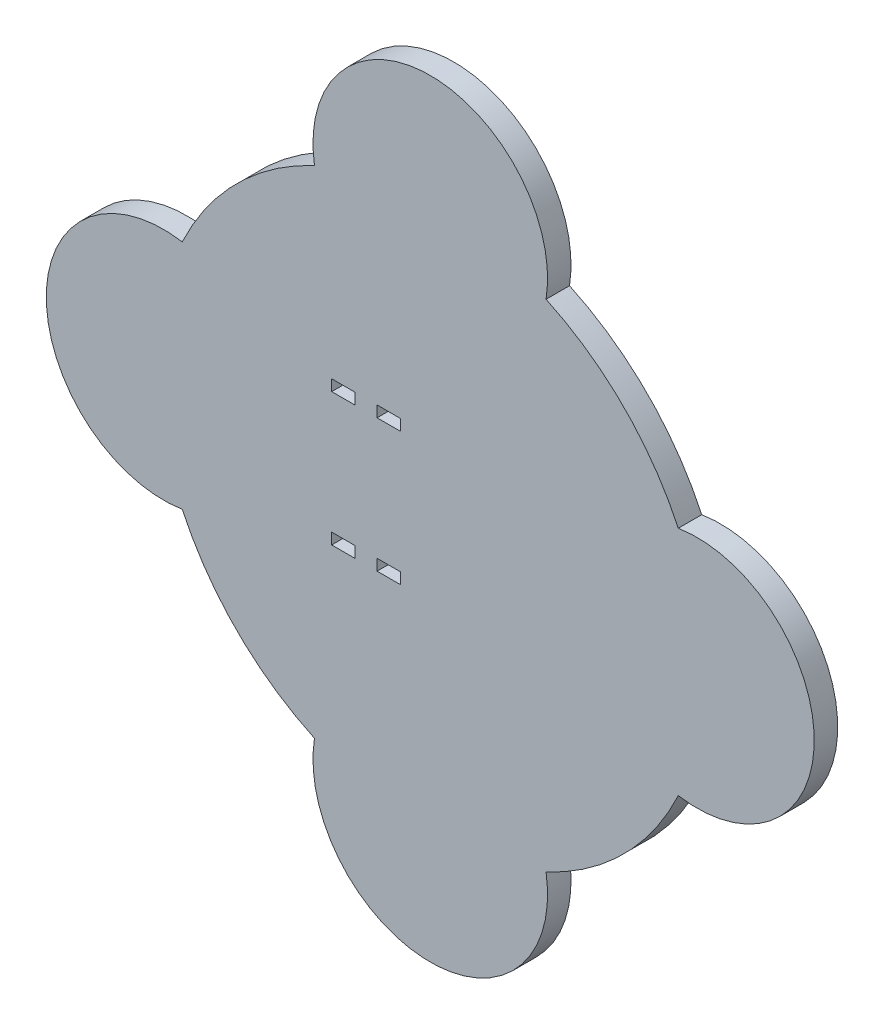
ISO-10303-21;
HEADER;
FILE_DESCRIPTION(('STEP AP214'),'2;1');
FILE_NAME('part.step','',(''),(''),'','','');
FILE_SCHEMA(('AUTOMOTIVE_DESIGN { 1 0 10303 214 1 1 1 1 }'));
ENDSEC;
DATA;
#1=APPLICATION_CONTEXT('core data for automotive mechanical design processes');
#2=APPLICATION_PROTOCOL_DEFINITION('international standard','automotive_design',2000,#1);
#3=PRODUCT_CONTEXT('',#1,'mechanical');
#4=PRODUCT('Part','Part','',(#3));
#5=PRODUCT_RELATED_PRODUCT_CATEGORY('part','',(#4));
#6=PRODUCT_DEFINITION_FORMATION('','',#4);
#7=PRODUCT_DEFINITION_CONTEXT('part definition',#1,'design');
#8=PRODUCT_DEFINITION('design','',#6,#7);
#9=PRODUCT_DEFINITION_SHAPE('','',#8);
#10=(LENGTH_UNIT() NAMED_UNIT(*) SI_UNIT(.MILLI.,.METRE.));
#11=(NAMED_UNIT(*) PLANE_ANGLE_UNIT() SI_UNIT($,.RADIAN.));
#12=(NAMED_UNIT(*) SI_UNIT($,.STERADIAN.) SOLID_ANGLE_UNIT());
#13=UNCERTAINTY_MEASURE_WITH_UNIT(LENGTH_MEASURE(1.E-05),#10,'distance_accuracy_value','');
#14=(GEOMETRIC_REPRESENTATION_CONTEXT(3) GLOBAL_UNCERTAINTY_ASSIGNED_CONTEXT((#13)) GLOBAL_UNIT_ASSIGNED_CONTEXT((#10,
#11,#12)) REPRESENTATION_CONTEXT('',''));
#15=CARTESIAN_POINT('',(0.,0.,0.));
#16=DIRECTION('',(0.,0.,1.));
#17=DIRECTION('',(1.,0.,0.));
#18=AXIS2_PLACEMENT_3D('',#15,#16,#17);
#19=CARTESIAN_POINT('',(0.,0.,3.));
#20=DIRECTION('',(0.,0.,-1.));
#21=DIRECTION('',(-1.,0.,0.));
#22=AXIS2_PLACEMENT_3D('',#19,#20,#21);
#23=CYLINDRICAL_SURFACE('',#22,35.);
#24=CARTESIAN_POINT('',(0.,0.,0.));
#25=DIRECTION('',(0.,0.,1.));
#26=DIRECTION('',(1.,0.,0.));
#27=AXIS2_PLACEMENT_3D('',#24,#25,#26);
#28=CIRCLE('',#27,35.);
#29=CARTESIAN_POINT('',(-14.8082520023187,31.7130205536436,0.));
#30=VERTEX_POINT('',#29);
#31=CARTESIAN_POINT('',(-31.7130205536436,14.8082520023187,0.));
#32=VERTEX_POINT('',#31);
#33=EDGE_CURVE('E322',#30,#32,#28,.T.);
#34=ORIENTED_EDGE('',*,*,#33,.T.);
#35=DIRECTION('',(0.,0.,-1.));
#36=VECTOR('',#35,1.);
#37=CARTESIAN_POINT('',(-31.7130205536436,14.8082520023187,3.));
#38=LINE('',#37,#36);
#39=CARTESIAN_POINT('',(-31.7130205536436,14.8082520023187,3.));
#40=VERTEX_POINT('',#39);
#41=EDGE_CURVE('E11',#40,#32,#38,.T.);
#42=ORIENTED_EDGE('',*,*,#41,.F.);
#43=CARTESIAN_POINT('',(0.,0.,3.));
#44=DIRECTION('',(0.,0.,1.));
#45=DIRECTION('',(1.,0.,0.));
#46=AXIS2_PLACEMENT_3D('',#43,#44,#45);
#47=CIRCLE('',#46,35.);
#48=CARTESIAN_POINT('',(-14.8082520023187,31.7130205536436,3.));
#49=VERTEX_POINT('',#48);
#50=EDGE_CURVE('E323',#49,#40,#47,.T.);
#51=ORIENTED_EDGE('',*,*,#50,.F.);
#52=DIRECTION('',(0.,0.,-1.));
#53=VECTOR('',#52,1.);
#54=CARTESIAN_POINT('',(-14.8082520023187,31.7130205536436,3.));
#55=LINE('',#54,#53);
#56=EDGE_CURVE('E341',#49,#30,#55,.T.);
#57=ORIENTED_EDGE('',*,*,#56,.T.);
#58=EDGE_LOOP('',(#34,#42,#51,#57));
#59=FACE_BOUND('',#58,.T.);
#60=ADVANCED_FACE('F32',(#59),#23,.T.);
#61=CARTESIAN_POINT('',(-34.1037678501647,0.,3.));
#62=DIRECTION('',(0.,0.,-1.));
#63=DIRECTION('',(-1.,0.,0.));
#64=AXIS2_PLACEMENT_3D('',#61,#62,#63);
#65=CYLINDRICAL_SURFACE('',#64,15.);
#66=CARTESIAN_POINT('',(-34.1037678501647,0.,0.));
#67=DIRECTION('',(0.,0.,1.));
#68=DIRECTION('',(-1.,0.,0.));
#69=AXIS2_PLACEMENT_3D('',#66,#67,#68);
#70=CIRCLE('',#69,15.);
#71=CARTESIAN_POINT('',(-31.7130205536436,-14.8082520023187,0.));
#72=VERTEX_POINT('',#71);
#73=EDGE_CURVE('E344',#32,#72,#70,.T.);
#74=ORIENTED_EDGE('',*,*,#73,.T.);
#75=DIRECTION('',(0.,0.,-1.));
#76=VECTOR('',#75,1.);
#77=CARTESIAN_POINT('',(-31.7130205536436,-14.8082520023187,3.));
#78=LINE('',#77,#76);
#79=CARTESIAN_POINT('',(-31.7130205536436,-14.8082520023187,3.));
#80=VERTEX_POINT('',#79);
#81=EDGE_CURVE('E39',#80,#72,#78,.T.);
#82=ORIENTED_EDGE('',*,*,#81,.F.);
#83=CARTESIAN_POINT('',(-34.1037678501647,0.,3.));
#84=DIRECTION('',(0.,0.,1.));
#85=DIRECTION('',(-1.,0.,0.));
#86=AXIS2_PLACEMENT_3D('',#83,#84,#85);
#87=CIRCLE('',#86,15.);
#88=EDGE_CURVE('E326',#40,#80,#87,.T.);
#89=ORIENTED_EDGE('',*,*,#88,.F.);
#90=ORIENTED_EDGE('',*,*,#41,.T.);
#91=EDGE_LOOP('',(#74,#82,#89,#90));
#92=FACE_BOUND('',#91,.T.);
#93=ADVANCED_FACE('F400',(#92),#65,.T.);
#94=CARTESIAN_POINT('',(0.,0.,3.));
#95=DIRECTION('',(0.,0.,-1.));
#96=DIRECTION('',(-1.,0.,0.));
#97=AXIS2_PLACEMENT_3D('',#94,#95,#96);
#98=CYLINDRICAL_SURFACE('',#97,35.);
#99=CARTESIAN_POINT('',(0.,0.,0.));
#100=DIRECTION('',(0.,0.,1.));
#101=DIRECTION('',(1.,0.,0.));
#102=AXIS2_PLACEMENT_3D('',#99,#100,#101);
#103=CIRCLE('',#102,35.);
#104=CARTESIAN_POINT('',(-14.8082520023187,-31.7130205536436,0.));
#105=VERTEX_POINT('',#104);
#106=EDGE_CURVE('E346',#72,#105,#103,.T.);
#107=ORIENTED_EDGE('',*,*,#106,.T.);
#108=DIRECTION('',(0.,0.,-1.));
#109=VECTOR('',#108,1.);
#110=CARTESIAN_POINT('',(-14.8082520023187,-31.7130205536436,3.));
#111=LINE('',#110,#109);
#112=CARTESIAN_POINT('',(-14.8082520023187,-31.7130205536436,3.));
#113=VERTEX_POINT('',#112);
#114=EDGE_CURVE('E371',#113,#105,#111,.T.);
#115=ORIENTED_EDGE('',*,*,#114,.F.);
#116=CARTESIAN_POINT('',(0.,0.,3.));
#117=DIRECTION('',(0.,0.,1.));
#118=DIRECTION('',(1.,0.,0.));
#119=AXIS2_PLACEMENT_3D('',#116,#117,#118);
#120=CIRCLE('',#119,35.);
#121=EDGE_CURVE('E329',#80,#113,#120,.T.);
#122=ORIENTED_EDGE('',*,*,#121,.F.);
#123=ORIENTED_EDGE('',*,*,#81,.T.);
#124=EDGE_LOOP('',(#107,#115,#122,#123));
#125=FACE_BOUND('',#124,.T.);
#126=ADVANCED_FACE('F378',(#125),#98,.T.);
#127=CARTESIAN_POINT('',(0.,-34.1037678501647,3.));
#128=DIRECTION('',(0.,0.,-1.));
#129=DIRECTION('',(-1.,0.,0.));
#130=AXIS2_PLACEMENT_3D('',#127,#128,#129);
#131=CYLINDRICAL_SURFACE('',#130,15.);
#132=CARTESIAN_POINT('',(0.,-34.1037678501647,0.));
#133=DIRECTION('',(0.,0.,1.));
#134=DIRECTION('',(-1.,0.,0.));
#135=AXIS2_PLACEMENT_3D('',#132,#133,#134);
#136=CIRCLE('',#135,15.);
#137=CARTESIAN_POINT('',(14.8082520023187,-31.7130205536436,0.));
#138=VERTEX_POINT('',#137);
#139=EDGE_CURVE('E348',#105,#138,#136,.T.);
#140=ORIENTED_EDGE('',*,*,#139,.T.);
#141=DIRECTION('',(0.,0.,-1.));
#142=VECTOR('',#141,1.);
#143=CARTESIAN_POINT('',(14.8082520023187,-31.7130205536436,3.));
#144=LINE('',#143,#142);
#145=CARTESIAN_POINT('',(14.8082520023187,-31.7130205536436,3.));
#146=VERTEX_POINT('',#145);
#147=EDGE_CURVE('E368',#146,#138,#144,.T.);
#148=ORIENTED_EDGE('',*,*,#147,.F.);
#149=CARTESIAN_POINT('',(0.,-34.1037678501647,3.));
#150=DIRECTION('',(0.,0.,1.));
#151=DIRECTION('',(-1.,0.,0.));
#152=AXIS2_PLACEMENT_3D('',#149,#150,#151);
#153=CIRCLE('',#152,15.);
#154=EDGE_CURVE('E331',#113,#146,#153,.T.);
#155=ORIENTED_EDGE('',*,*,#154,.F.);
#156=ORIENTED_EDGE('',*,*,#114,.T.);
#157=EDGE_LOOP('',(#140,#148,#155,#156));
#158=FACE_BOUND('',#157,.T.);
#159=ADVANCED_FACE('F388',(#158),#131,.T.);
#160=CARTESIAN_POINT('',(0.,0.,3.));
#161=DIRECTION('',(0.,0.,-1.));
#162=DIRECTION('',(-1.,0.,0.));
#163=AXIS2_PLACEMENT_3D('',#160,#161,#162);
#164=CYLINDRICAL_SURFACE('',#163,35.);
#165=CARTESIAN_POINT('',(0.,0.,0.));
#166=DIRECTION('',(0.,0.,1.));
#167=DIRECTION('',(1.,0.,0.));
#168=AXIS2_PLACEMENT_3D('',#165,#166,#167);
#169=CIRCLE('',#168,35.);
#170=CARTESIAN_POINT('',(31.7130205536436,-14.8082520023187,0.));
#171=VERTEX_POINT('',#170);
#172=EDGE_CURVE('E350',#138,#171,#169,.T.);
#173=ORIENTED_EDGE('',*,*,#172,.T.);
#174=DIRECTION('',(0.,0.,-1.));
#175=VECTOR('',#174,1.);
#176=CARTESIAN_POINT('',(31.7130205536436,-14.8082520023187,3.));
#177=LINE('',#176,#175);
#178=CARTESIAN_POINT('',(31.7130205536436,-14.8082520023187,3.));
#179=VERTEX_POINT('',#178);
#180=EDGE_CURVE('E365',#179,#171,#177,.T.);
#181=ORIENTED_EDGE('',*,*,#180,.F.);
#182=CARTESIAN_POINT('',(0.,0.,3.));
#183=DIRECTION('',(0.,0.,1.));
#184=DIRECTION('',(1.,0.,0.));
#185=AXIS2_PLACEMENT_3D('',#182,#183,#184);
#186=CIRCLE('',#185,35.);
#187=EDGE_CURVE('E333',#146,#179,#186,.T.);
#188=ORIENTED_EDGE('',*,*,#187,.F.);
#189=ORIENTED_EDGE('',*,*,#147,.T.);
#190=EDGE_LOOP('',(#173,#181,#188,#189));
#191=FACE_BOUND('',#190,.T.);
#192=ADVANCED_FACE('F392',(#191),#164,.T.);
#193=CARTESIAN_POINT('',(34.1037678501647,0.,3.));
#194=DIRECTION('',(0.,0.,-1.));
#195=DIRECTION('',(-1.,0.,0.));
#196=AXIS2_PLACEMENT_3D('',#193,#194,#195);
#197=CYLINDRICAL_SURFACE('',#196,15.);
#198=CARTESIAN_POINT('',(34.1037678501647,0.,0.));
#199=DIRECTION('',(0.,0.,1.));
#200=DIRECTION('',(-1.,0.,0.));
#201=AXIS2_PLACEMENT_3D('',#198,#199,#200);
#202=CIRCLE('',#201,15.);
#203=CARTESIAN_POINT('',(31.7130205536436,14.8082520023187,0.));
#204=VERTEX_POINT('',#203);
#205=EDGE_CURVE('E352',#171,#204,#202,.T.);
#206=ORIENTED_EDGE('',*,*,#205,.T.);
#207=DIRECTION('',(0.,0.,-1.));
#208=VECTOR('',#207,1.);
#209=CARTESIAN_POINT('',(31.7130205536436,14.8082520023187,3.));
#210=LINE('',#209,#208);
#211=CARTESIAN_POINT('',(31.7130205536436,14.8082520023187,3.));
#212=VERTEX_POINT('',#211);
#213=EDGE_CURVE('E362',#212,#204,#210,.T.);
#214=ORIENTED_EDGE('',*,*,#213,.F.);
#215=CARTESIAN_POINT('',(34.1037678501647,0.,3.));
#216=DIRECTION('',(0.,0.,1.));
#217=DIRECTION('',(-1.,0.,0.));
#218=AXIS2_PLACEMENT_3D('',#215,#216,#217);
#219=CIRCLE('',#218,15.);
#220=EDGE_CURVE('E335',#179,#212,#219,.T.);
#221=ORIENTED_EDGE('',*,*,#220,.F.);
#222=ORIENTED_EDGE('',*,*,#180,.T.);
#223=EDGE_LOOP('',(#206,#214,#221,#222));
#224=FACE_BOUND('',#223,.T.);
#225=ADVANCED_FACE('F413',(#224),#197,.T.);
#226=CARTESIAN_POINT('',(0.,0.,3.));
#227=DIRECTION('',(0.,0.,-1.));
#228=DIRECTION('',(-1.,0.,0.));
#229=AXIS2_PLACEMENT_3D('',#226,#227,#228);
#230=CYLINDRICAL_SURFACE('',#229,35.);
#231=CARTESIAN_POINT('',(0.,0.,0.));
#232=DIRECTION('',(0.,0.,1.));
#233=DIRECTION('',(1.,0.,0.));
#234=AXIS2_PLACEMENT_3D('',#231,#232,#233);
#235=CIRCLE('',#234,35.);
#236=CARTESIAN_POINT('',(14.8082520023187,31.7130205536436,0.));
#237=VERTEX_POINT('',#236);
#238=EDGE_CURVE('E354',#204,#237,#235,.T.);
#239=ORIENTED_EDGE('',*,*,#238,.T.);
#240=DIRECTION('',(0.,0.,-1.));
#241=VECTOR('',#240,1.);
#242=CARTESIAN_POINT('',(14.8082520023187,31.7130205536436,3.));
#243=LINE('',#242,#241);
#244=CARTESIAN_POINT('',(14.8082520023187,31.7130205536436,3.));
#245=VERTEX_POINT('',#244);
#246=EDGE_CURVE('E359',#245,#237,#243,.T.);
#247=ORIENTED_EDGE('',*,*,#246,.F.);
#248=CARTESIAN_POINT('',(0.,0.,3.));
#249=DIRECTION('',(0.,0.,1.));
#250=DIRECTION('',(1.,0.,0.));
#251=AXIS2_PLACEMENT_3D('',#248,#249,#250);
#252=CIRCLE('',#251,35.);
#253=EDGE_CURVE('E337',#212,#245,#252,.T.);
#254=ORIENTED_EDGE('',*,*,#253,.F.);
#255=ORIENTED_EDGE('',*,*,#213,.T.);
#256=EDGE_LOOP('',(#239,#247,#254,#255));
#257=FACE_BOUND('',#256,.T.);
#258=ADVANCED_FACE('F411',(#257),#230,.T.);
#259=CARTESIAN_POINT('',(0.,34.1037678501647,3.));
#260=DIRECTION('',(0.,0.,-1.));
#261=DIRECTION('',(-1.,0.,0.));
#262=AXIS2_PLACEMENT_3D('',#259,#260,#261);
#263=CYLINDRICAL_SURFACE('',#262,15.);
#264=CARTESIAN_POINT('',(0.,34.1037678501647,0.));
#265=DIRECTION('',(0.,0.,1.));
#266=DIRECTION('',(-1.,0.,0.));
#267=AXIS2_PLACEMENT_3D('',#264,#265,#266);
#268=CIRCLE('',#267,15.);
#269=EDGE_CURVE('E327',#237,#30,#268,.T.);
#270=ORIENTED_EDGE('',*,*,#269,.T.);
#271=ORIENTED_EDGE('',*,*,#56,.F.);
#272=CARTESIAN_POINT('',(0.,34.1037678501647,3.));
#273=DIRECTION('',(0.,0.,1.));
#274=DIRECTION('',(-1.,0.,0.));
#275=AXIS2_PLACEMENT_3D('',#272,#273,#274);
#276=CIRCLE('',#275,15.);
#277=EDGE_CURVE('E339',#245,#49,#276,.T.);
#278=ORIENTED_EDGE('',*,*,#277,.F.);
#279=ORIENTED_EDGE('',*,*,#246,.T.);
#280=EDGE_LOOP('',(#270,#271,#278,#279));
#281=FACE_BOUND('',#280,.T.);
#282=ADVANCED_FACE('F406',(#281),#263,.T.);
#283=CARTESIAN_POINT('',(-17.0518839250824,0.,3.));
#284=DIRECTION('',(0.,0.,1.));
#285=DIRECTION('',(1.,0.,0.));
#286=AXIS2_PLACEMENT_3D('',#283,#284,#285);
#287=PLANE('',#286);
#288=DIRECTION('',(-1.,0.,0.));
#289=VECTOR('',#288,1.);
#290=CARTESIAN_POINT('',(-6.80376785016473,9.20196326465761,3.));
#291=LINE('',#290,#289);
#292=CARTESIAN_POINT('',(-3.80376785016473,9.20196326465761,3.));
#293=VERTEX_POINT('',#292);
#294=CARTESIAN_POINT('',(-6.80376785016473,9.20196326465761,3.));
#295=VERTEX_POINT('',#294);
#296=EDGE_CURVE('E46',#293,#295,#291,.T.);
#297=ORIENTED_EDGE('',*,*,#296,.F.);
#298=DIRECTION('',(0.,1.,0.));
#299=VECTOR('',#298,1.);
#300=CARTESIAN_POINT('',(-3.80376785016473,9.20196326465761,3.));
#301=LINE('',#300,#299);
#302=CARTESIAN_POINT('',(-3.80376785016473,7.77947969500303,3.));
#303=VERTEX_POINT('',#302);
#304=EDGE_CURVE('E200',#303,#293,#301,.T.);
#305=ORIENTED_EDGE('',*,*,#304,.F.);
#306=DIRECTION('',(1.,0.,0.));
#307=VECTOR('',#306,1.);
#308=CARTESIAN_POINT('',(-6.80376785016473,7.77947969500303,3.));
#309=LINE('',#308,#307);
#310=CARTESIAN_POINT('',(-6.80376785016473,7.77947969500303,3.));
#311=VERTEX_POINT('',#310);
#312=EDGE_CURVE('E223',#311,#303,#309,.T.);
#313=ORIENTED_EDGE('',*,*,#312,.F.);
#314=DIRECTION('',(0.,-1.,0.));
#315=VECTOR('',#314,1.);
#316=CARTESIAN_POINT('',(-6.80376785016473,9.20196326465761,3.));
#317=LINE('',#316,#315);
#318=EDGE_CURVE('E216',#295,#311,#317,.T.);
#319=ORIENTED_EDGE('',*,*,#318,.F.);
#320=EDGE_LOOP('',(#297,#305,#313,#319));
#321=FACE_BOUND('',#320,.T.);
#322=DIRECTION('',(-1.,0.,0.));
#323=VECTOR('',#322,1.);
#324=CARTESIAN_POINT('',(-9.60376785016472,9.20196326465761,3.));
#325=LINE('',#324,#323);
#326=CARTESIAN_POINT('',(-9.60376785016472,9.20196326465761,3.));
#327=VERTEX_POINT('',#326);
#328=CARTESIAN_POINT('',(-12.6037678501647,9.20196326465761,3.));
#329=VERTEX_POINT('',#328);
#330=EDGE_CURVE('E54',#327,#329,#325,.T.);
#331=ORIENTED_EDGE('',*,*,#330,.F.);
#332=DIRECTION('',(0.,1.,0.));
#333=VECTOR('',#332,1.);
#334=CARTESIAN_POINT('',(-9.60376785016472,9.20196326465761,3.));
#335=LINE('',#334,#333);
#336=CARTESIAN_POINT('',(-9.60376785016472,7.77947969500303,3.));
#337=VERTEX_POINT('',#336);
#338=EDGE_CURVE('E248',#337,#327,#335,.T.);
#339=ORIENTED_EDGE('',*,*,#338,.F.);
#340=DIRECTION('',(1.,0.,0.));
#341=VECTOR('',#340,1.);
#342=CARTESIAN_POINT('',(-9.60376785016472,7.77947969500303,3.));
#343=LINE('',#342,#341);
#344=CARTESIAN_POINT('',(-12.6037678501647,7.77947969500303,3.));
#345=VERTEX_POINT('',#344);
#346=EDGE_CURVE('E245',#345,#337,#343,.T.);
#347=ORIENTED_EDGE('',*,*,#346,.F.);
#348=DIRECTION('',(0.,-1.,0.));
#349=VECTOR('',#348,1.);
#350=CARTESIAN_POINT('',(-12.6037678501647,9.20196326465761,3.));
#351=LINE('',#350,#349);
#352=EDGE_CURVE('E242',#329,#345,#351,.T.);
#353=ORIENTED_EDGE('',*,*,#352,.F.);
#354=EDGE_LOOP('',(#331,#339,#347,#353));
#355=FACE_BOUND('',#354,.T.);
#356=DIRECTION('',(1.,0.,0.));
#357=VECTOR('',#356,1.);
#358=CARTESIAN_POINT('',(-9.60376785016472,-9.20196326465761,3.));
#359=LINE('',#358,#357);
#360=CARTESIAN_POINT('',(-12.6037678501647,-9.20196326465761,3.));
#361=VERTEX_POINT('',#360);
#362=CARTESIAN_POINT('',(-9.60376785016472,-9.20196326465761,3.));
#363=VERTEX_POINT('',#362);
#364=EDGE_CURVE('E270',#361,#363,#359,.T.);
#365=ORIENTED_EDGE('',*,*,#364,.F.);
#366=DIRECTION('',(0.,-1.,0.));
#367=VECTOR('',#366,1.);
#368=CARTESIAN_POINT('',(-12.6037678501647,-9.20196326465761,3.));
#369=LINE('',#368,#367);
#370=CARTESIAN_POINT('',(-12.6037678501647,-7.77947969500303,3.));
#371=VERTEX_POINT('',#370);
#372=EDGE_CURVE('E278',#371,#361,#369,.T.);
#373=ORIENTED_EDGE('',*,*,#372,.F.);
#374=DIRECTION('',(-1.,0.,0.));
#375=VECTOR('',#374,1.);
#376=CARTESIAN_POINT('',(-9.60376785016472,-7.77947969500303,3.));
#377=LINE('',#376,#375);
#378=CARTESIAN_POINT('',(-9.60376785016472,-7.77947969500303,3.));
#379=VERTEX_POINT('',#378);
#380=EDGE_CURVE('E275',#379,#371,#377,.T.);
#381=ORIENTED_EDGE('',*,*,#380,.F.);
#382=DIRECTION('',(0.,1.,0.));
#383=VECTOR('',#382,1.);
#384=CARTESIAN_POINT('',(-9.60376785016472,-9.20196326465761,3.));
#385=LINE('',#384,#383);
#386=EDGE_CURVE('E272',#363,#379,#385,.T.);
#387=ORIENTED_EDGE('',*,*,#386,.F.);
#388=EDGE_LOOP('',(#365,#373,#381,#387));
#389=FACE_BOUND('',#388,.T.);
#390=DIRECTION('',(0.,1.,0.));
#391=VECTOR('',#390,1.);
#392=CARTESIAN_POINT('',(-3.80376785016473,-9.20196326465761,3.));
#393=LINE('',#392,#391);
#394=CARTESIAN_POINT('',(-3.80376785016473,-9.20196326465761,3.));
#395=VERTEX_POINT('',#394);
#396=CARTESIAN_POINT('',(-3.80376785016473,-7.77947969500303,3.));
#397=VERTEX_POINT('',#396);
#398=EDGE_CURVE('E299',#395,#397,#393,.T.);
#399=ORIENTED_EDGE('',*,*,#398,.F.);
#400=DIRECTION('',(1.,0.,0.));
#401=VECTOR('',#400,1.);
#402=CARTESIAN_POINT('',(-6.80376785016473,-9.20196326465761,3.));
#403=LINE('',#402,#401);
#404=CARTESIAN_POINT('',(-6.80376785016473,-9.20196326465761,3.));
#405=VERTEX_POINT('',#404);
#406=EDGE_CURVE('E307',#405,#395,#403,.T.);
#407=ORIENTED_EDGE('',*,*,#406,.F.);
#408=DIRECTION('',(0.,-1.,0.));
#409=VECTOR('',#408,1.);
#410=CARTESIAN_POINT('',(-6.80376785016473,-9.20196326465761,3.));
#411=LINE('',#410,#409);
#412=CARTESIAN_POINT('',(-6.80376785016473,-7.77947969500303,3.));
#413=VERTEX_POINT('',#412);
#414=EDGE_CURVE('E304',#413,#405,#411,.T.);
#415=ORIENTED_EDGE('',*,*,#414,.F.);
#416=DIRECTION('',(-1.,0.,0.));
#417=VECTOR('',#416,1.);
#418=CARTESIAN_POINT('',(-6.80376785016473,-7.77947969500303,3.));
#419=LINE('',#418,#417);
#420=EDGE_CURVE('E301',#397,#413,#419,.T.);
#421=ORIENTED_EDGE('',*,*,#420,.F.);
#422=EDGE_LOOP('',(#399,#407,#415,#421));
#423=FACE_BOUND('',#422,.T.);
#424=ORIENTED_EDGE('',*,*,#50,.T.);
#425=ORIENTED_EDGE('',*,*,#88,.T.);
#426=ORIENTED_EDGE('',*,*,#121,.T.);
#427=ORIENTED_EDGE('',*,*,#154,.T.);
#428=ORIENTED_EDGE('',*,*,#187,.T.);
#429=ORIENTED_EDGE('',*,*,#220,.T.);
#430=ORIENTED_EDGE('',*,*,#253,.T.);
#431=ORIENTED_EDGE('',*,*,#277,.T.);
#432=EDGE_LOOP('',(#424,#425,#426,#427,#428,#429,#430,#431));
#433=FACE_BOUND('',#432,.T.);
#434=ADVANCED_FACE('F396',(#321,#355,#389,#423,#433),#287,.T.);
#435=CARTESIAN_POINT('',(-17.0518839250824,0.,0.));
#436=DIRECTION('',(0.,0.,1.));
#437=DIRECTION('',(1.,0.,0.));
#438=AXIS2_PLACEMENT_3D('',#435,#436,#437);
#439=PLANE('',#438);
#440=DIRECTION('',(0.,-1.,0.));
#441=VECTOR('',#440,1.);
#442=CARTESIAN_POINT('',(-3.80376785016473,9.20196326465761,0.));
#443=LINE('',#442,#441);
#444=CARTESIAN_POINT('',(-3.80376785016473,9.20196326465761,0.));
#445=VERTEX_POINT('',#444);
#446=CARTESIAN_POINT('',(-3.80376785016473,7.77947969500303,0.));
#447=VERTEX_POINT('',#446);
#448=EDGE_CURVE('E214',#445,#447,#443,.T.);
#449=ORIENTED_EDGE('',*,*,#448,.F.);
#450=DIRECTION('',(1.,0.,0.));
#451=VECTOR('',#450,1.);
#452=CARTESIAN_POINT('',(-6.80376785016473,9.20196326465761,0.));
#453=LINE('',#452,#451);
#454=CARTESIAN_POINT('',(-6.80376785016473,9.20196326465761,0.));
#455=VERTEX_POINT('',#454);
#456=EDGE_CURVE('E194',#455,#445,#453,.T.);
#457=ORIENTED_EDGE('',*,*,#456,.F.);
#458=DIRECTION('',(0.,1.,0.));
#459=VECTOR('',#458,1.);
#460=CARTESIAN_POINT('',(-6.80376785016473,9.20196326465761,0.));
#461=LINE('',#460,#459);
#462=CARTESIAN_POINT('',(-6.80376785016473,7.77947969500303,0.));
#463=VERTEX_POINT('',#462);
#464=EDGE_CURVE('E204',#463,#455,#461,.T.);
#465=ORIENTED_EDGE('',*,*,#464,.F.);
#466=DIRECTION('',(-1.,0.,0.));
#467=VECTOR('',#466,1.);
#468=CARTESIAN_POINT('',(-6.80376785016473,7.77947969500303,0.));
#469=LINE('',#468,#467);
#470=EDGE_CURVE('E218',#447,#463,#469,.T.);
#471=ORIENTED_EDGE('',*,*,#470,.F.);
#472=EDGE_LOOP('',(#449,#457,#465,#471));
#473=FACE_BOUND('',#472,.T.);
#474=DIRECTION('',(0.,-1.,0.));
#475=VECTOR('',#474,1.);
#476=CARTESIAN_POINT('',(-9.60376785016472,9.20196326465761,0.));
#477=LINE('',#476,#475);
#478=CARTESIAN_POINT('',(-9.60376785016472,9.20196326465761,0.));
#479=VERTEX_POINT('',#478);
#480=CARTESIAN_POINT('',(-9.60376785016472,7.77947969500303,0.));
#481=VERTEX_POINT('',#480);
#482=EDGE_CURVE('E234',#479,#481,#477,.T.);
#483=ORIENTED_EDGE('',*,*,#482,.F.);
#484=DIRECTION('',(1.,0.,0.));
#485=VECTOR('',#484,1.);
#486=CARTESIAN_POINT('',(-9.60376785016472,9.20196326465761,0.));
#487=LINE('',#486,#485);
#488=CARTESIAN_POINT('',(-12.6037678501647,9.20196326465761,0.));
#489=VERTEX_POINT('',#488);
#490=EDGE_CURVE('E238',#489,#479,#487,.T.);
#491=ORIENTED_EDGE('',*,*,#490,.F.);
#492=DIRECTION('',(0.,1.,0.));
#493=VECTOR('',#492,1.);
#494=CARTESIAN_POINT('',(-12.6037678501647,9.20196326465761,0.));
#495=LINE('',#494,#493);
#496=CARTESIAN_POINT('',(-12.6037678501647,7.77947969500303,0.));
#497=VERTEX_POINT('',#496);
#498=EDGE_CURVE('E254',#497,#489,#495,.T.);
#499=ORIENTED_EDGE('',*,*,#498,.F.);
#500=DIRECTION('',(-1.,0.,0.));
#501=VECTOR('',#500,1.);
#502=CARTESIAN_POINT('',(-9.60376785016472,7.77947969500303,0.));
#503=LINE('',#502,#501);
#504=EDGE_CURVE('E232',#481,#497,#503,.T.);
#505=ORIENTED_EDGE('',*,*,#504,.F.);
#506=EDGE_LOOP('',(#483,#491,#499,#505));
#507=FACE_BOUND('',#506,.T.);
#508=DIRECTION('',(0.,1.,0.));
#509=VECTOR('',#508,1.);
#510=CARTESIAN_POINT('',(-12.6037678501647,-9.20196326465761,0.));
#511=LINE('',#510,#509);
#512=CARTESIAN_POINT('',(-12.6037678501647,-9.20196326465761,0.));
#513=VERTEX_POINT('',#512);
#514=CARTESIAN_POINT('',(-12.6037678501647,-7.77947969500303,0.));
#515=VERTEX_POINT('',#514);
#516=EDGE_CURVE('E264',#513,#515,#511,.T.);
#517=ORIENTED_EDGE('',*,*,#516,.F.);
#518=DIRECTION('',(-1.,0.,0.));
#519=VECTOR('',#518,1.);
#520=CARTESIAN_POINT('',(-9.60376785016472,-9.20196326465761,0.));
#521=LINE('',#520,#519);
#522=CARTESIAN_POINT('',(-9.60376785016472,-9.20196326465761,0.));
#523=VERTEX_POINT('',#522);
#524=EDGE_CURVE('E267',#523,#513,#521,.T.);
#525=ORIENTED_EDGE('',*,*,#524,.F.);
#526=DIRECTION('',(0.,-1.,0.));
#527=VECTOR('',#526,1.);
#528=CARTESIAN_POINT('',(-9.60376785016472,-9.20196326465761,0.));
#529=LINE('',#528,#527);
#530=CARTESIAN_POINT('',(-9.60376785016472,-7.77947969500303,0.));
#531=VERTEX_POINT('',#530);
#532=EDGE_CURVE('E235',#531,#523,#529,.T.);
#533=ORIENTED_EDGE('',*,*,#532,.F.);
#534=DIRECTION('',(1.,0.,0.));
#535=VECTOR('',#534,1.);
#536=CARTESIAN_POINT('',(-9.60376785016472,-7.77947969500303,0.));
#537=LINE('',#536,#535);
#538=EDGE_CURVE('E262',#515,#531,#537,.T.);
#539=ORIENTED_EDGE('',*,*,#538,.F.);
#540=EDGE_LOOP('',(#517,#525,#533,#539));
#541=FACE_BOUND('',#540,.T.);
#542=DIRECTION('',(-1.,0.,0.));
#543=VECTOR('',#542,1.);
#544=CARTESIAN_POINT('',(-6.80376785016473,-9.20196326465761,0.));
#545=LINE('',#544,#543);
#546=CARTESIAN_POINT('',(-3.80376785016473,-9.20196326465761,0.));
#547=VERTEX_POINT('',#546);
#548=CARTESIAN_POINT('',(-6.80376785016473,-9.20196326465761,0.));
#549=VERTEX_POINT('',#548);
#550=EDGE_CURVE('E293',#547,#549,#545,.T.);
#551=ORIENTED_EDGE('',*,*,#550,.F.);
#552=DIRECTION('',(0.,-1.,0.));
#553=VECTOR('',#552,1.);
#554=CARTESIAN_POINT('',(-3.80376785016473,-9.20196326465761,0.));
#555=LINE('',#554,#553);
#556=CARTESIAN_POINT('',(-3.80376785016473,-7.77947969500303,0.));
#557=VERTEX_POINT('',#556);
#558=EDGE_CURVE('E296',#557,#547,#555,.T.);
#559=ORIENTED_EDGE('',*,*,#558,.F.);
#560=DIRECTION('',(1.,0.,0.));
#561=VECTOR('',#560,1.);
#562=CARTESIAN_POINT('',(-6.80376785016473,-7.77947969500303,0.));
#563=LINE('',#562,#561);
#564=CARTESIAN_POINT('',(-6.80376785016473,-7.77947969500303,0.));
#565=VERTEX_POINT('',#564);
#566=EDGE_CURVE('E313',#565,#557,#563,.T.);
#567=ORIENTED_EDGE('',*,*,#566,.F.);
#568=DIRECTION('',(0.,1.,0.));
#569=VECTOR('',#568,1.);
#570=CARTESIAN_POINT('',(-6.80376785016473,-9.20196326465761,0.));
#571=LINE('',#570,#569);
#572=EDGE_CURVE('E208',#549,#565,#571,.T.);
#573=ORIENTED_EDGE('',*,*,#572,.F.);
#574=EDGE_LOOP('',(#551,#559,#567,#573));
#575=FACE_BOUND('',#574,.T.);
#576=ORIENTED_EDGE('',*,*,#33,.F.);
#577=ORIENTED_EDGE('',*,*,#269,.F.);
#578=ORIENTED_EDGE('',*,*,#238,.F.);
#579=ORIENTED_EDGE('',*,*,#205,.F.);
#580=ORIENTED_EDGE('',*,*,#172,.F.);
#581=ORIENTED_EDGE('',*,*,#139,.F.);
#582=ORIENTED_EDGE('',*,*,#106,.F.);
#583=ORIENTED_EDGE('',*,*,#73,.F.);
#584=EDGE_LOOP('',(#576,#577,#578,#579,#580,#581,#582,#583));
#585=FACE_BOUND('',#584,.T.);
#586=ADVANCED_FACE('F211',(#473,#507,#541,#575,#585),#439,.F.);
#587=CARTESIAN_POINT('',(-3.80376785016473,-9.20196326465761,-0.00100000000000013));
#588=DIRECTION('',(1.,0.,0.));
#589=DIRECTION('',(0.,0.,-1.));
#590=AXIS2_PLACEMENT_3D('',#587,#588,#589);
#591=PLANE('',#590);
#592=ORIENTED_EDGE('',*,*,#558,.T.);
#593=DIRECTION('',(0.,0.,1.));
#594=VECTOR('',#593,1.);
#595=CARTESIAN_POINT('',(-3.80376785016473,-9.20196326465761,-0.00100000000000013));
#596=LINE('',#595,#594);
#597=EDGE_CURVE('E311',#547,#395,#596,.T.);
#598=ORIENTED_EDGE('',*,*,#597,.T.);
#599=ORIENTED_EDGE('',*,*,#398,.T.);
#600=DIRECTION('',(0.,0.,1.));
#601=VECTOR('',#600,1.);
#602=CARTESIAN_POINT('',(-3.80376785016473,-7.77947969500303,-0.00100000000000013));
#603=LINE('',#602,#601);
#604=EDGE_CURVE('E310',#557,#397,#603,.T.);
#605=ORIENTED_EDGE('',*,*,#604,.F.);
#606=EDGE_LOOP('',(#592,#598,#599,#605));
#607=FACE_BOUND('',#606,.T.);
#608=ADVANCED_FACE('F476',(#607),#591,.F.);
#609=CARTESIAN_POINT('',(-6.80376785016473,-9.20196326465761,-0.00100000000000013));
#610=DIRECTION('',(0.,-1.,0.));
#611=DIRECTION('',(0.,0.,-1.));
#612=AXIS2_PLACEMENT_3D('',#609,#610,#611);
#613=PLANE('',#612);
#614=ORIENTED_EDGE('',*,*,#550,.T.);
#615=DIRECTION('',(0.,0.,1.));
#616=VECTOR('',#615,1.);
#617=CARTESIAN_POINT('',(-6.80376785016473,-9.20196326465761,-0.00100000000000013));
#618=LINE('',#617,#616);
#619=EDGE_CURVE('E314',#549,#405,#618,.T.);
#620=ORIENTED_EDGE('',*,*,#619,.T.);
#621=ORIENTED_EDGE('',*,*,#406,.T.);
#622=ORIENTED_EDGE('',*,*,#597,.F.);
#623=EDGE_LOOP('',(#614,#620,#621,#622));
#624=FACE_BOUND('',#623,.T.);
#625=ADVANCED_FACE('F485',(#624),#613,.F.);
#626=CARTESIAN_POINT('',(-6.80376785016473,-9.20196326465761,-0.00100000000000013));
#627=DIRECTION('',(-1.,0.,0.));
#628=DIRECTION('',(0.,0.,1.));
#629=AXIS2_PLACEMENT_3D('',#626,#627,#628);
#630=PLANE('',#629);
#631=ORIENTED_EDGE('',*,*,#572,.T.);
#632=DIRECTION('',(0.,0.,1.));
#633=VECTOR('',#632,1.);
#634=CARTESIAN_POINT('',(-6.80376785016473,-7.77947969500303,-0.00100000000000013));
#635=LINE('',#634,#633);
#636=EDGE_CURVE('E316',#565,#413,#635,.T.);
#637=ORIENTED_EDGE('',*,*,#636,.T.);
#638=ORIENTED_EDGE('',*,*,#414,.T.);
#639=ORIENTED_EDGE('',*,*,#619,.F.);
#640=EDGE_LOOP('',(#631,#637,#638,#639));
#641=FACE_BOUND('',#640,.T.);
#642=ADVANCED_FACE('F495',(#641),#630,.F.);
#643=CARTESIAN_POINT('',(-6.80376785016473,-7.77947969500303,-0.00100000000000013));
#644=DIRECTION('',(0.,1.,0.));
#645=DIRECTION('',(0.,0.,1.));
#646=AXIS2_PLACEMENT_3D('',#643,#644,#645);
#647=PLANE('',#646);
#648=ORIENTED_EDGE('',*,*,#566,.T.);
#649=ORIENTED_EDGE('',*,*,#604,.T.);
#650=ORIENTED_EDGE('',*,*,#420,.T.);
#651=ORIENTED_EDGE('',*,*,#636,.F.);
#652=EDGE_LOOP('',(#648,#649,#650,#651));
#653=FACE_BOUND('',#652,.T.);
#654=ADVANCED_FACE('F505',(#653),#647,.F.);
#655=CARTESIAN_POINT('',(-9.60376785016472,-9.20196326465761,-0.00100000000000013));
#656=DIRECTION('',(0.,-1.,0.));
#657=DIRECTION('',(1.,0.,0.));
#658=AXIS2_PLACEMENT_3D('',#655,#656,#657);
#659=PLANE('',#658);
#660=ORIENTED_EDGE('',*,*,#524,.T.);
#661=DIRECTION('',(0.,0.,1.));
#662=VECTOR('',#661,1.);
#663=CARTESIAN_POINT('',(-12.6037678501647,-9.20196326465761,-0.00100000000000013));
#664=LINE('',#663,#662);
#665=EDGE_CURVE('E282',#513,#361,#664,.T.);
#666=ORIENTED_EDGE('',*,*,#665,.T.);
#667=ORIENTED_EDGE('',*,*,#364,.T.);
#668=DIRECTION('',(0.,0.,1.));
#669=VECTOR('',#668,1.);
#670=CARTESIAN_POINT('',(-9.60376785016472,-9.20196326465761,-0.00100000000000013));
#671=LINE('',#670,#669);
#672=EDGE_CURVE('E281',#523,#363,#671,.T.);
#673=ORIENTED_EDGE('',*,*,#672,.F.);
#674=EDGE_LOOP('',(#660,#666,#667,#673));
#675=FACE_BOUND('',#674,.T.);
#676=ADVANCED_FACE('F515',(#675),#659,.F.);
#677=CARTESIAN_POINT('',(-12.6037678501647,-9.20196326465761,-0.00100000000000013));
#678=DIRECTION('',(-1.,0.,0.));
#679=DIRECTION('',(0.,0.,1.));
#680=AXIS2_PLACEMENT_3D('',#677,#678,#679);
#681=PLANE('',#680);
#682=ORIENTED_EDGE('',*,*,#516,.T.);
#683=DIRECTION('',(0.,0.,1.));
#684=VECTOR('',#683,1.);
#685=CARTESIAN_POINT('',(-12.6037678501647,-7.77947969500303,-0.00100000000000013));
#686=LINE('',#685,#684);
#687=EDGE_CURVE('E284',#515,#371,#686,.T.);
#688=ORIENTED_EDGE('',*,*,#687,.T.);
#689=ORIENTED_EDGE('',*,*,#372,.T.);
#690=ORIENTED_EDGE('',*,*,#665,.F.);
#691=EDGE_LOOP('',(#682,#688,#689,#690));
#692=FACE_BOUND('',#691,.T.);
#693=ADVANCED_FACE('F525',(#692),#681,.F.);
#694=CARTESIAN_POINT('',(-9.60376785016472,-7.77947969500303,-0.00100000000000013));
#695=DIRECTION('',(0.,1.,0.));
#696=DIRECTION('',(-1.,0.,0.));
#697=AXIS2_PLACEMENT_3D('',#694,#695,#696);
#698=PLANE('',#697);
#699=ORIENTED_EDGE('',*,*,#538,.T.);
#700=DIRECTION('',(0.,0.,1.));
#701=VECTOR('',#700,1.);
#702=CARTESIAN_POINT('',(-9.60376785016472,-7.77947969500303,-0.00100000000000013));
#703=LINE('',#702,#701);
#704=EDGE_CURVE('E286',#531,#379,#703,.T.);
#705=ORIENTED_EDGE('',*,*,#704,.T.);
#706=ORIENTED_EDGE('',*,*,#380,.T.);
#707=ORIENTED_EDGE('',*,*,#687,.F.);
#708=EDGE_LOOP('',(#699,#705,#706,#707));
#709=FACE_BOUND('',#708,.T.);
#710=ADVANCED_FACE('F535',(#709),#698,.F.);
#711=CARTESIAN_POINT('',(-9.60376785016472,-9.20196326465761,-0.00100000000000013));
#712=DIRECTION('',(1.,0.,0.));
#713=DIRECTION('',(0.,0.,-1.));
#714=AXIS2_PLACEMENT_3D('',#711,#712,#713);
#715=PLANE('',#714);
#716=ORIENTED_EDGE('',*,*,#532,.T.);
#717=ORIENTED_EDGE('',*,*,#672,.T.);
#718=ORIENTED_EDGE('',*,*,#386,.T.);
#719=ORIENTED_EDGE('',*,*,#704,.F.);
#720=EDGE_LOOP('',(#716,#717,#718,#719));
#721=FACE_BOUND('',#720,.T.);
#722=ADVANCED_FACE('F545',(#721),#715,.F.);
#723=CARTESIAN_POINT('',(-9.60376785016472,9.20196326465761,-0.00100000000000013));
#724=DIRECTION('',(0.,1.,0.));
#725=DIRECTION('',(-1.,0.,0.));
#726=AXIS2_PLACEMENT_3D('',#723,#724,#725);
#727=PLANE('',#726);
#728=ORIENTED_EDGE('',*,*,#490,.T.);
#729=DIRECTION('',(0.,0.,1.));
#730=VECTOR('',#729,1.);
#731=CARTESIAN_POINT('',(-9.60376785016472,9.20196326465761,-0.00100000000000013));
#732=LINE('',#731,#730);
#733=EDGE_CURVE('E252',#479,#327,#732,.T.);
#734=ORIENTED_EDGE('',*,*,#733,.T.);
#735=ORIENTED_EDGE('',*,*,#330,.T.);
#736=DIRECTION('',(0.,0.,1.));
#737=VECTOR('',#736,1.);
#738=CARTESIAN_POINT('',(-12.6037678501647,9.20196326465761,-0.00100000000000013));
#739=LINE('',#738,#737);
#740=EDGE_CURVE('E251',#489,#329,#739,.T.);
#741=ORIENTED_EDGE('',*,*,#740,.F.);
#742=EDGE_LOOP('',(#728,#734,#735,#741));
#743=FACE_BOUND('',#742,.T.);
#744=ADVANCED_FACE('F555',(#743),#727,.F.);
#745=CARTESIAN_POINT('',(-9.60376785016472,9.20196326465761,-0.00100000000000013));
#746=DIRECTION('',(1.,0.,0.));
#747=DIRECTION('',(0.,0.,-1.));
#748=AXIS2_PLACEMENT_3D('',#745,#746,#747);
#749=PLANE('',#748);
#750=ORIENTED_EDGE('',*,*,#482,.T.);
#751=DIRECTION('',(0.,0.,1.));
#752=VECTOR('',#751,1.);
#753=CARTESIAN_POINT('',(-9.60376785016472,7.77947969500303,-0.00100000000000013));
#754=LINE('',#753,#752);
#755=EDGE_CURVE('E255',#481,#337,#754,.T.);
#756=ORIENTED_EDGE('',*,*,#755,.T.);
#757=ORIENTED_EDGE('',*,*,#338,.T.);
#758=ORIENTED_EDGE('',*,*,#733,.F.);
#759=EDGE_LOOP('',(#750,#756,#757,#758));
#760=FACE_BOUND('',#759,.T.);
#761=ADVANCED_FACE('F565',(#760),#749,.F.);
#762=CARTESIAN_POINT('',(-9.60376785016472,7.77947969500303,-0.00100000000000013));
#763=DIRECTION('',(0.,-1.,0.));
#764=DIRECTION('',(1.,0.,0.));
#765=AXIS2_PLACEMENT_3D('',#762,#763,#764);
#766=PLANE('',#765);
#767=ORIENTED_EDGE('',*,*,#504,.T.);
#768=DIRECTION('',(0.,0.,1.));
#769=VECTOR('',#768,1.);
#770=CARTESIAN_POINT('',(-12.6037678501647,7.77947969500303,-0.00100000000000013));
#771=LINE('',#770,#769);
#772=EDGE_CURVE('E257',#497,#345,#771,.T.);
#773=ORIENTED_EDGE('',*,*,#772,.T.);
#774=ORIENTED_EDGE('',*,*,#346,.T.);
#775=ORIENTED_EDGE('',*,*,#755,.F.);
#776=EDGE_LOOP('',(#767,#773,#774,#775));
#777=FACE_BOUND('',#776,.T.);
#778=ADVANCED_FACE('F574',(#777),#766,.F.);
#779=CARTESIAN_POINT('',(-12.6037678501647,9.20196326465761,-0.00100000000000013));
#780=DIRECTION('',(-1.,0.,0.));
#781=DIRECTION('',(0.,0.,1.));
#782=AXIS2_PLACEMENT_3D('',#779,#780,#781);
#783=PLANE('',#782);
#784=ORIENTED_EDGE('',*,*,#498,.T.);
#785=ORIENTED_EDGE('',*,*,#740,.T.);
#786=ORIENTED_EDGE('',*,*,#352,.T.);
#787=ORIENTED_EDGE('',*,*,#772,.F.);
#788=EDGE_LOOP('',(#784,#785,#786,#787));
#789=FACE_BOUND('',#788,.T.);
#790=ADVANCED_FACE('F584',(#789),#783,.F.);
#791=CARTESIAN_POINT('',(-6.80376785016473,9.20196326465761,-0.00100000000000013));
#792=DIRECTION('',(0.,1.,0.));
#793=DIRECTION('',(0.,0.,1.));
#794=AXIS2_PLACEMENT_3D('',#791,#792,#793);
#795=PLANE('',#794);
#796=ORIENTED_EDGE('',*,*,#456,.T.);
#797=DIRECTION('',(0.,0.,1.));
#798=VECTOR('',#797,1.);
#799=CARTESIAN_POINT('',(-3.80376785016473,9.20196326465761,-0.00100000000000013));
#800=LINE('',#799,#798);
#801=EDGE_CURVE('E209',#445,#293,#800,.T.);
#802=ORIENTED_EDGE('',*,*,#801,.T.);
#803=ORIENTED_EDGE('',*,*,#296,.T.);
#804=DIRECTION('',(0.,0.,1.));
#805=VECTOR('',#804,1.);
#806=CARTESIAN_POINT('',(-6.80376785016473,9.20196326465761,-0.00100000000000013));
#807=LINE('',#806,#805);
#808=EDGE_CURVE('E190',#455,#295,#807,.T.);
#809=ORIENTED_EDGE('',*,*,#808,.F.);
#810=EDGE_LOOP('',(#796,#802,#803,#809));
#811=FACE_BOUND('',#810,.T.);
#812=ADVANCED_FACE('F192',(#811),#795,.F.);
#813=CARTESIAN_POINT('',(-3.80376785016473,9.20196326465761,-0.00100000000000013));
#814=DIRECTION('',(1.,0.,0.));
#815=DIRECTION('',(0.,0.,-1.));
#816=AXIS2_PLACEMENT_3D('',#813,#814,#815);
#817=PLANE('',#816);
#818=ORIENTED_EDGE('',*,*,#448,.T.);
#819=DIRECTION('',(0.,0.,1.));
#820=VECTOR('',#819,1.);
#821=CARTESIAN_POINT('',(-3.80376785016473,7.77947969500303,-0.00100000000000013));
#822=LINE('',#821,#820);
#823=EDGE_CURVE('E229',#447,#303,#822,.T.);
#824=ORIENTED_EDGE('',*,*,#823,.T.);
#825=ORIENTED_EDGE('',*,*,#304,.T.);
#826=ORIENTED_EDGE('',*,*,#801,.F.);
#827=EDGE_LOOP('',(#818,#824,#825,#826));
#828=FACE_BOUND('',#827,.T.);
#829=ADVANCED_FACE('F603',(#828),#817,.F.);
#830=CARTESIAN_POINT('',(-6.80376785016473,7.77947969500303,-0.00100000000000013));
#831=DIRECTION('',(0.,-1.,0.));
#832=DIRECTION('',(0.,0.,-1.));
#833=AXIS2_PLACEMENT_3D('',#830,#831,#832);
#834=PLANE('',#833);
#835=ORIENTED_EDGE('',*,*,#470,.T.);
#836=DIRECTION('',(0.,0.,1.));
#837=VECTOR('',#836,1.);
#838=CARTESIAN_POINT('',(-6.80376785016473,7.77947969500303,-0.00100000000000013));
#839=LINE('',#838,#837);
#840=EDGE_CURVE('E199',#463,#311,#839,.T.);
#841=ORIENTED_EDGE('',*,*,#840,.T.);
#842=ORIENTED_EDGE('',*,*,#312,.T.);
#843=ORIENTED_EDGE('',*,*,#823,.F.);
#844=EDGE_LOOP('',(#835,#841,#842,#843));
#845=FACE_BOUND('',#844,.T.);
#846=ADVANCED_FACE('F612',(#845),#834,.F.);
#847=CARTESIAN_POINT('',(-6.80376785016473,9.20196326465761,-0.00100000000000013));
#848=DIRECTION('',(-1.,0.,0.));
#849=DIRECTION('',(0.,0.,1.));
#850=AXIS2_PLACEMENT_3D('',#847,#848,#849);
#851=PLANE('',#850);
#852=ORIENTED_EDGE('',*,*,#464,.T.);
#853=ORIENTED_EDGE('',*,*,#808,.T.);
#854=ORIENTED_EDGE('',*,*,#318,.T.);
#855=ORIENTED_EDGE('',*,*,#840,.F.);
#856=EDGE_LOOP('',(#852,#853,#854,#855));
#857=FACE_BOUND('',#856,.T.);
#858=ADVANCED_FACE('F205',(#857),#851,.F.);
#859=CLOSED_SHELL('',(#60,#93,#126,#159,#192,#225,#258,#282,#434,#586,#608,#625,#642,#654,#676,
#693,#710,#722,#744,#761,#778,#790,#812,#829,#846,#858));
#860=MANIFOLD_SOLID_BREP('B2',#859);
#861=ADVANCED_BREP_SHAPE_REPRESENTATION('',(#18,#860),#14);
#862=SHAPE_DEFINITION_REPRESENTATION(#9,#861);
ENDSEC;
END-ISO-10303-21;
